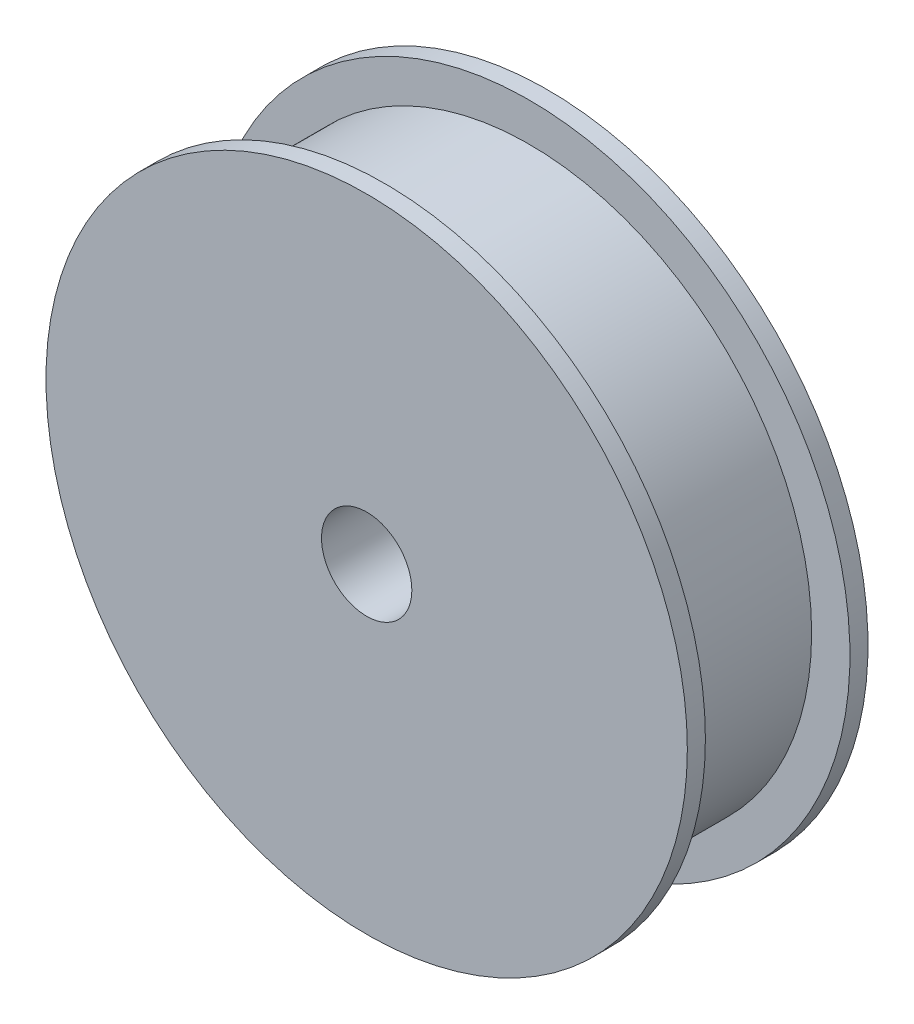
ISO-10303-21;
HEADER;
FILE_DESCRIPTION(('STEP AP214'),'2;1');
FILE_NAME('part.step','',(''),(''),'','','');
FILE_SCHEMA(('AUTOMOTIVE_DESIGN { 1 0 10303 214 1 1 1 1 }'));
ENDSEC;
DATA;
#1=APPLICATION_CONTEXT('core data for automotive mechanical design processes');
#2=APPLICATION_PROTOCOL_DEFINITION('international standard','automotive_design',2000,#1);
#3=PRODUCT_CONTEXT('',#1,'mechanical');
#4=PRODUCT('Part','Part','',(#3));
#5=PRODUCT_RELATED_PRODUCT_CATEGORY('part','',(#4));
#6=PRODUCT_DEFINITION_FORMATION('','',#4);
#7=PRODUCT_DEFINITION_CONTEXT('part definition',#1,'design');
#8=PRODUCT_DEFINITION('design','',#6,#7);
#9=PRODUCT_DEFINITION_SHAPE('','',#8);
#10=(LENGTH_UNIT() NAMED_UNIT(*) SI_UNIT(.MILLI.,.METRE.));
#11=(NAMED_UNIT(*) PLANE_ANGLE_UNIT() SI_UNIT($,.RADIAN.));
#12=(NAMED_UNIT(*) SI_UNIT($,.STERADIAN.) SOLID_ANGLE_UNIT());
#13=UNCERTAINTY_MEASURE_WITH_UNIT(LENGTH_MEASURE(1.E-05),#10,'distance_accuracy_value','');
#14=(GEOMETRIC_REPRESENTATION_CONTEXT(3) GLOBAL_UNCERTAINTY_ASSIGNED_CONTEXT((#13)) GLOBAL_UNIT_ASSIGNED_CONTEXT((#10,
#11,#12)) REPRESENTATION_CONTEXT('',''));
#15=CARTESIAN_POINT('',(0.,0.,0.));
#16=DIRECTION('',(0.,0.,1.));
#17=DIRECTION('',(1.,0.,0.));
#18=AXIS2_PLACEMENT_3D('',#15,#16,#17);
#19=CARTESIAN_POINT('',(0.,0.,16.));
#20=DIRECTION('',(0.,0.,-1.));
#21=DIRECTION('',(-1.,0.,0.));
#22=AXIS2_PLACEMENT_3D('',#19,#20,#21);
#23=CYLINDRICAL_SURFACE('',#22,31.26);
#24=CARTESIAN_POINT('',(0.,0.,16.));
#25=DIRECTION('',(0.,0.,1.));
#26=DIRECTION('',(1.,0.,0.));
#27=AXIS2_PLACEMENT_3D('',#24,#25,#26);
#28=CIRCLE('',#27,31.26);
#29=CARTESIAN_POINT('',(31.26,0.,16.));
#30=VERTEX_POINT('',#29);
#31=EDGE_CURVE('E10',#30,#30,#28,.T.);
#32=ORIENTED_EDGE('',*,*,#31,.F.);
#33=EDGE_LOOP('',(#32));
#34=FACE_BOUND('',#33,.T.);
#35=CARTESIAN_POINT('',(0.,0.,0.));
#36=DIRECTION('',(0.,0.,1.));
#37=DIRECTION('',(1.,0.,0.));
#38=AXIS2_PLACEMENT_3D('',#35,#36,#37);
#39=CIRCLE('',#38,31.26);
#40=CARTESIAN_POINT('',(31.26,0.,0.));
#41=VERTEX_POINT('',#40);
#42=EDGE_CURVE('E38',#41,#41,#39,.T.);
#43=ORIENTED_EDGE('',*,*,#42,.T.);
#44=EDGE_LOOP('',(#43));
#45=FACE_BOUND('',#44,.T.);
#46=ADVANCED_FACE('F35',(#34,#45),#23,.T.);
#47=CARTESIAN_POINT('',(0.,0.,0.));
#48=DIRECTION('',(0.,0.,1.));
#49=DIRECTION('',(1.,0.,0.));
#50=AXIS2_PLACEMENT_3D('',#47,#48,#49);
#51=CYLINDRICAL_SURFACE('',#50,5.);
#52=CARTESIAN_POINT('',(0.,0.,18.));
#53=DIRECTION('',(0.,0.,1.));
#54=DIRECTION('',(1.,0.,0.));
#55=AXIS2_PLACEMENT_3D('',#52,#53,#54);
#56=CIRCLE('',#55,5.);
#57=CARTESIAN_POINT('',(5.,0.,18.));
#58=VERTEX_POINT('',#57);
#59=EDGE_CURVE('E50',#58,#58,#56,.T.);
#60=ORIENTED_EDGE('',*,*,#59,.T.);
#61=EDGE_LOOP('',(#60));
#62=FACE_BOUND('',#61,.T.);
#63=CARTESIAN_POINT('',(0.,0.,-2.));
#64=DIRECTION('',(0.,0.,-1.));
#65=DIRECTION('',(-1.,0.,0.));
#66=AXIS2_PLACEMENT_3D('',#63,#64,#65);
#67=CIRCLE('',#66,5.);
#68=CARTESIAN_POINT('',(-5.,0.,-2.));
#69=VERTEX_POINT('',#68);
#70=EDGE_CURVE('E58',#69,#69,#67,.T.);
#71=ORIENTED_EDGE('',*,*,#70,.T.);
#72=EDGE_LOOP('',(#71));
#73=FACE_BOUND('',#72,.T.);
#74=ADVANCED_FACE('F64',(#62,#73),#51,.F.);
#75=CARTESIAN_POINT('',(0.,0.,18.));
#76=DIRECTION('',(0.,0.,1.));
#77=DIRECTION('',(1.,0.,0.));
#78=AXIS2_PLACEMENT_3D('',#75,#76,#77);
#79=PLANE('',#78);
#80=CARTESIAN_POINT('',(0.,0.,18.));
#81=DIRECTION('',(0.,0.,1.));
#82=DIRECTION('',(1.,0.,0.));
#83=AXIS2_PLACEMENT_3D('',#80,#81,#82);
#84=CIRCLE('',#83,35.5);
#85=CARTESIAN_POINT('',(35.5,0.,18.));
#86=VERTEX_POINT('',#85);
#87=EDGE_CURVE('E42',#86,#86,#84,.T.);
#88=ORIENTED_EDGE('',*,*,#87,.T.);
#89=EDGE_LOOP('',(#88));
#90=FACE_BOUND('',#89,.T.);
#91=ORIENTED_EDGE('',*,*,#59,.F.);
#92=EDGE_LOOP('',(#91));
#93=FACE_BOUND('',#92,.T.);
#94=ADVANCED_FACE('F87',(#90,#93),#79,.T.);
#95=CARTESIAN_POINT('',(0.,0.,16.));
#96=DIRECTION('',(0.,0.,1.));
#97=DIRECTION('',(1.,0.,0.));
#98=AXIS2_PLACEMENT_3D('',#95,#96,#97);
#99=PLANE('',#98);
#100=ORIENTED_EDGE('',*,*,#31,.T.);
#101=EDGE_LOOP('',(#100));
#102=FACE_BOUND('',#101,.T.);
#103=CARTESIAN_POINT('',(0.,0.,16.));
#104=DIRECTION('',(0.,0.,1.));
#105=DIRECTION('',(1.,0.,0.));
#106=AXIS2_PLACEMENT_3D('',#103,#104,#105);
#107=CIRCLE('',#106,35.5);
#108=CARTESIAN_POINT('',(35.5,0.,16.));
#109=VERTEX_POINT('',#108);
#110=EDGE_CURVE('E46',#109,#109,#107,.T.);
#111=ORIENTED_EDGE('',*,*,#110,.F.);
#112=EDGE_LOOP('',(#111));
#113=FACE_BOUND('',#112,.T.);
#114=ADVANCED_FACE('F79',(#102,#113),#99,.F.);
#115=CARTESIAN_POINT('',(0.,0.,18.));
#116=DIRECTION('',(0.,0.,-1.));
#117=DIRECTION('',(-1.,0.,0.));
#118=AXIS2_PLACEMENT_3D('',#115,#116,#117);
#119=CYLINDRICAL_SURFACE('',#118,35.5);
#120=ORIENTED_EDGE('',*,*,#87,.F.);
#121=EDGE_LOOP('',(#120));
#122=FACE_BOUND('',#121,.T.);
#123=ORIENTED_EDGE('',*,*,#110,.T.);
#124=EDGE_LOOP('',(#123));
#125=FACE_BOUND('',#124,.T.);
#126=ADVANCED_FACE('F69',(#122,#125),#119,.T.);
#127=CARTESIAN_POINT('',(0.,0.,-2.));
#128=DIRECTION('',(0.,0.,-1.));
#129=DIRECTION('',(-1.,0.,0.));
#130=AXIS2_PLACEMENT_3D('',#127,#128,#129);
#131=PLANE('',#130);
#132=CARTESIAN_POINT('',(0.,0.,-2.));
#133=DIRECTION('',(0.,0.,-1.));
#134=DIRECTION('',(-1.,0.,0.));
#135=AXIS2_PLACEMENT_3D('',#132,#133,#134);
#136=CIRCLE('',#135,35.5);
#137=CARTESIAN_POINT('',(-35.5,0.,-2.));
#138=VERTEX_POINT('',#137);
#139=EDGE_CURVE('E57',#138,#138,#136,.T.);
#140=ORIENTED_EDGE('',*,*,#139,.T.);
#141=EDGE_LOOP('',(#140));
#142=FACE_BOUND('',#141,.T.);
#143=ORIENTED_EDGE('',*,*,#70,.F.);
#144=EDGE_LOOP('',(#143));
#145=FACE_BOUND('',#144,.T.);
#146=ADVANCED_FACE('F66',(#142,#145),#131,.T.);
#147=CARTESIAN_POINT('',(0.,0.,0.));
#148=DIRECTION('',(0.,0.,-1.));
#149=DIRECTION('',(-1.,0.,0.));
#150=AXIS2_PLACEMENT_3D('',#147,#148,#149);
#151=PLANE('',#150);
#152=ORIENTED_EDGE('',*,*,#42,.F.);
#153=EDGE_LOOP('',(#152));
#154=FACE_BOUND('',#153,.T.);
#155=CARTESIAN_POINT('',(0.,0.,0.));
#156=DIRECTION('',(0.,0.,-1.));
#157=DIRECTION('',(-1.,0.,0.));
#158=AXIS2_PLACEMENT_3D('',#155,#156,#157);
#159=CIRCLE('',#158,35.5);
#160=CARTESIAN_POINT('',(-35.5,0.,0.));
#161=VERTEX_POINT('',#160);
#162=EDGE_CURVE('E54',#161,#161,#159,.T.);
#163=ORIENTED_EDGE('',*,*,#162,.F.);
#164=EDGE_LOOP('',(#163));
#165=FACE_BOUND('',#164,.T.);
#166=ADVANCED_FACE('F68',(#154,#165),#151,.F.);
#167=CARTESIAN_POINT('',(0.,0.,-2.));
#168=DIRECTION('',(0.,0.,1.));
#169=DIRECTION('',(1.,0.,0.));
#170=AXIS2_PLACEMENT_3D('',#167,#168,#169);
#171=CYLINDRICAL_SURFACE('',#170,35.5);
#172=ORIENTED_EDGE('',*,*,#139,.F.);
#173=EDGE_LOOP('',(#172));
#174=FACE_BOUND('',#173,.T.);
#175=ORIENTED_EDGE('',*,*,#162,.T.);
#176=EDGE_LOOP('',(#175));
#177=FACE_BOUND('',#176,.T.);
#178=ADVANCED_FACE('F76',(#174,#177),#171,.T.);
#179=CLOSED_SHELL('',(#46,#74,#94,#114,#126,#146,#166,#178));
#180=MANIFOLD_SOLID_BREP('B2',#179);
#181=ADVANCED_BREP_SHAPE_REPRESENTATION('',(#18,#180),#14);
#182=SHAPE_DEFINITION_REPRESENTATION(#9,#181);
ENDSEC;
END-ISO-10303-21;
